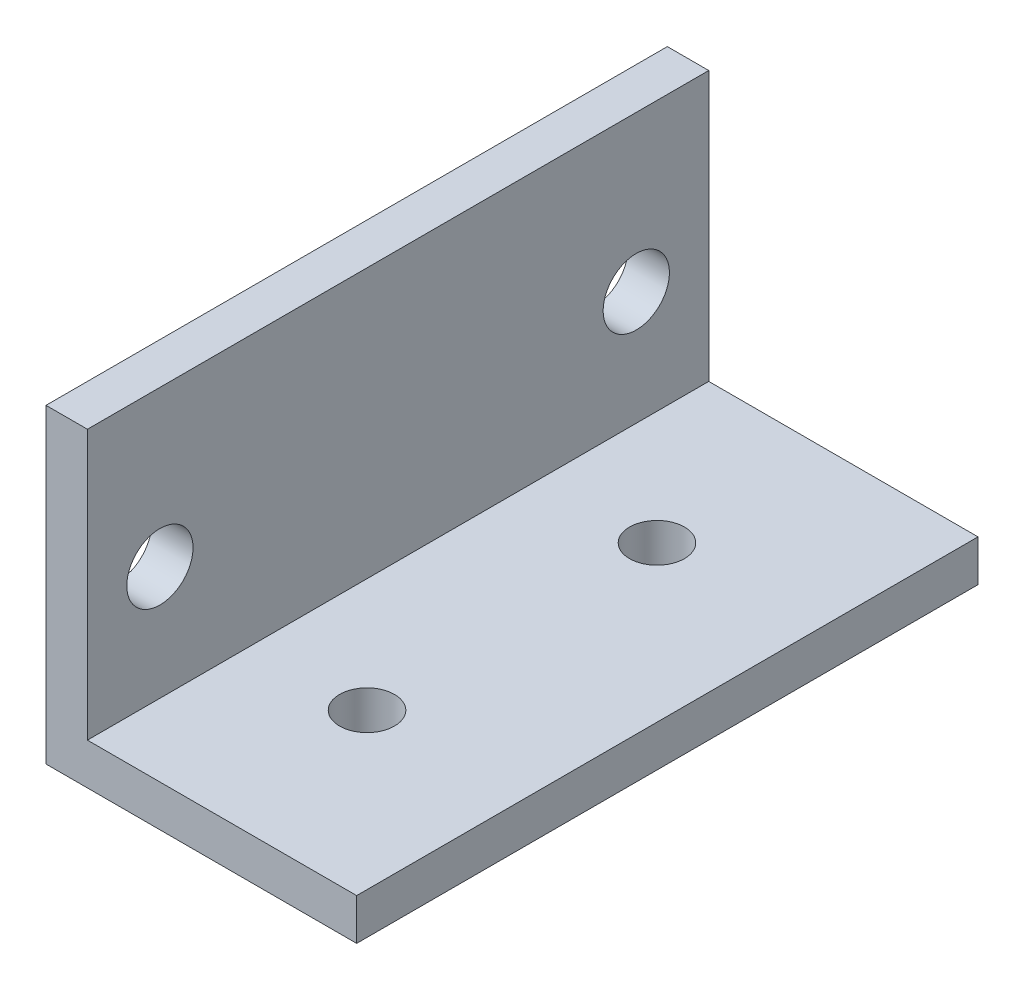
ISO-10303-21;
HEADER;
FILE_DESCRIPTION(('STEP AP214'),'2;1');
FILE_NAME('part.step','',(''),(''),'','','');
FILE_SCHEMA(('AUTOMOTIVE_DESIGN { 1 0 10303 214 1 1 1 1 }'));
ENDSEC;
DATA;
#1=APPLICATION_CONTEXT('core data for automotive mechanical design processes');
#2=APPLICATION_PROTOCOL_DEFINITION('international standard','automotive_design',2000,#1);
#3=PRODUCT_CONTEXT('',#1,'mechanical');
#4=PRODUCT('Part','Part','',(#3));
#5=PRODUCT_RELATED_PRODUCT_CATEGORY('part','',(#4));
#6=PRODUCT_DEFINITION_FORMATION('','',#4);
#7=PRODUCT_DEFINITION_CONTEXT('part definition',#1,'design');
#8=PRODUCT_DEFINITION('design','',#6,#7);
#9=PRODUCT_DEFINITION_SHAPE('','',#8);
#10=(LENGTH_UNIT() NAMED_UNIT(*) SI_UNIT(.MILLI.,.METRE.));
#11=(NAMED_UNIT(*) PLANE_ANGLE_UNIT() SI_UNIT($,.RADIAN.));
#12=(NAMED_UNIT(*) SI_UNIT($,.STERADIAN.) SOLID_ANGLE_UNIT());
#13=UNCERTAINTY_MEASURE_WITH_UNIT(LENGTH_MEASURE(1.E-05),#10,'distance_accuracy_value','');
#14=(GEOMETRIC_REPRESENTATION_CONTEXT(3) GLOBAL_UNCERTAINTY_ASSIGNED_CONTEXT((#13)) GLOBAL_UNIT_ASSIGNED_CONTEXT((#10,
#11,#12)) REPRESENTATION_CONTEXT('',''));
#15=CARTESIAN_POINT('',(0.,0.,0.));
#16=DIRECTION('',(0.,0.,1.));
#17=DIRECTION('',(1.,0.,0.));
#18=AXIS2_PLACEMENT_3D('',#15,#16,#17);
#19=CARTESIAN_POINT('',(4.,30.,60.));
#20=DIRECTION('',(0.,-1.,0.));
#21=DIRECTION('',(0.,0.,-1.));
#22=AXIS2_PLACEMENT_3D('',#19,#20,#21);
#23=PLANE('',#22);
#24=DIRECTION('',(-1.,0.,0.));
#25=VECTOR('',#24,1.);
#26=CARTESIAN_POINT('',(4.,30.,0.));
#27=LINE('',#26,#25);
#28=CARTESIAN_POINT('',(4.,30.,0.));
#29=VERTEX_POINT('',#28);
#30=CARTESIAN_POINT('',(0.,30.,0.));
#31=VERTEX_POINT('',#30);
#32=EDGE_CURVE('E118',#29,#31,#27,.T.);
#33=ORIENTED_EDGE('',*,*,#32,.T.);
#34=DIRECTION('',(0.,0.,-1.));
#35=VECTOR('',#34,1.);
#36=CARTESIAN_POINT('',(0.,30.,60.));
#37=LINE('',#36,#35);
#38=CARTESIAN_POINT('',(0.,30.,60.));
#39=VERTEX_POINT('',#38);
#40=EDGE_CURVE('E11',#39,#31,#37,.T.);
#41=ORIENTED_EDGE('',*,*,#40,.F.);
#42=DIRECTION('',(-1.,0.,0.));
#43=VECTOR('',#42,1.);
#44=CARTESIAN_POINT('',(4.,30.,60.));
#45=LINE('',#44,#43);
#46=CARTESIAN_POINT('',(4.,30.,60.));
#47=VERTEX_POINT('',#46);
#48=EDGE_CURVE('E129',#47,#39,#45,.T.);
#49=ORIENTED_EDGE('',*,*,#48,.F.);
#50=DIRECTION('',(0.,0.,-1.));
#51=VECTOR('',#50,1.);
#52=CARTESIAN_POINT('',(4.,30.,60.));
#53=LINE('',#52,#51);
#54=EDGE_CURVE('E114',#47,#29,#53,.T.);
#55=ORIENTED_EDGE('',*,*,#54,.T.);
#56=EDGE_LOOP('',(#33,#41,#49,#55));
#57=FACE_BOUND('',#56,.T.);
#58=ADVANCED_FACE('F33',(#57),#23,.F.);
#59=CARTESIAN_POINT('',(0.,30.,60.));
#60=DIRECTION('',(1.,0.,0.));
#61=DIRECTION('',(0.,0.,-1.));
#62=AXIS2_PLACEMENT_3D('',#59,#60,#61);
#63=PLANE('',#62);
#64=CARTESIAN_POINT('',(0.,15.,7.));
#65=DIRECTION('',(-1.,0.,0.));
#66=DIRECTION('',(0.,0.,1.));
#67=AXIS2_PLACEMENT_3D('',#64,#65,#66);
#68=CIRCLE('',#67,3.2);
#69=CARTESIAN_POINT('',(0.,15.,10.2));
#70=VERTEX_POINT('',#69);
#71=EDGE_CURVE('E270',#70,#70,#68,.T.);
#72=ORIENTED_EDGE('',*,*,#71,.F.);
#73=EDGE_LOOP('',(#72));
#74=FACE_BOUND('',#73,.T.);
#75=CARTESIAN_POINT('',(0.,15.,53.));
#76=DIRECTION('',(-1.,0.,0.));
#77=DIRECTION('',(0.,0.,1.));
#78=AXIS2_PLACEMENT_3D('',#75,#76,#77);
#79=CIRCLE('',#78,3.2);
#80=CARTESIAN_POINT('',(0.,15.,56.2));
#81=VERTEX_POINT('',#80);
#82=EDGE_CURVE('E260',#81,#81,#79,.T.);
#83=ORIENTED_EDGE('',*,*,#82,.F.);
#84=EDGE_LOOP('',(#83));
#85=FACE_BOUND('',#84,.T.);
#86=DIRECTION('',(0.,-1.,0.));
#87=VECTOR('',#86,1.);
#88=CARTESIAN_POINT('',(0.,30.,0.));
#89=LINE('',#88,#87);
#90=CARTESIAN_POINT('',(0.,0.,0.));
#91=VERTEX_POINT('',#90);
#92=EDGE_CURVE('E121',#31,#91,#89,.T.);
#93=ORIENTED_EDGE('',*,*,#92,.T.);
#94=DIRECTION('',(0.,0.,-1.));
#95=VECTOR('',#94,1.);
#96=CARTESIAN_POINT('',(0.,0.,60.));
#97=LINE('',#96,#95);
#98=CARTESIAN_POINT('',(0.,0.,60.));
#99=VERTEX_POINT('',#98);
#100=EDGE_CURVE('E42',#99,#91,#97,.T.);
#101=ORIENTED_EDGE('',*,*,#100,.F.);
#102=DIRECTION('',(0.,-1.,0.));
#103=VECTOR('',#102,1.);
#104=CARTESIAN_POINT('',(0.,30.,60.));
#105=LINE('',#104,#103);
#106=EDGE_CURVE('E87',#39,#99,#105,.T.);
#107=ORIENTED_EDGE('',*,*,#106,.F.);
#108=ORIENTED_EDGE('',*,*,#40,.T.);
#109=EDGE_LOOP('',(#93,#101,#107,#108));
#110=FACE_BOUND('',#109,.T.);
#111=ADVANCED_FACE('F158',(#74,#85,#110),#63,.F.);
#112=CARTESIAN_POINT('',(0.,0.,60.));
#113=DIRECTION('',(0.,1.,0.));
#114=DIRECTION('',(0.,0.,1.));
#115=AXIS2_PLACEMENT_3D('',#112,#113,#114);
#116=PLANE('',#115);
#117=CARTESIAN_POINT('',(15.,0.,16.));
#118=DIRECTION('',(0.,-1.,0.));
#119=DIRECTION('',(0.,0.,-1.));
#120=AXIS2_PLACEMENT_3D('',#117,#118,#119);
#121=CIRCLE('',#120,2.65);
#122=CARTESIAN_POINT('',(15.,0.,13.35));
#123=VERTEX_POINT('',#122);
#124=EDGE_CURVE('E279',#123,#123,#121,.T.);
#125=ORIENTED_EDGE('',*,*,#124,.F.);
#126=EDGE_LOOP('',(#125));
#127=FACE_BOUND('',#126,.T.);
#128=CARTESIAN_POINT('',(15.,0.,44.));
#129=DIRECTION('',(0.,-1.,0.));
#130=DIRECTION('',(0.,0.,-1.));
#131=AXIS2_PLACEMENT_3D('',#128,#129,#130);
#132=CIRCLE('',#131,2.65);
#133=CARTESIAN_POINT('',(15.,0.,41.35));
#134=VERTEX_POINT('',#133);
#135=EDGE_CURVE('E276',#134,#134,#132,.T.);
#136=ORIENTED_EDGE('',*,*,#135,.F.);
#137=EDGE_LOOP('',(#136));
#138=FACE_BOUND('',#137,.T.);
#139=DIRECTION('',(1.,0.,0.));
#140=VECTOR('',#139,1.);
#141=CARTESIAN_POINT('',(0.,0.,0.));
#142=LINE('',#141,#140);
#143=CARTESIAN_POINT('',(30.,0.,0.));
#144=VERTEX_POINT('',#143);
#145=EDGE_CURVE('E124',#91,#144,#142,.T.);
#146=ORIENTED_EDGE('',*,*,#145,.T.);
#147=DIRECTION('',(0.,0.,-1.));
#148=VECTOR('',#147,1.);
#149=CARTESIAN_POINT('',(30.,0.,60.));
#150=LINE('',#149,#148);
#151=CARTESIAN_POINT('',(30.,0.,60.));
#152=VERTEX_POINT('',#151);
#153=EDGE_CURVE('E109',#152,#144,#150,.T.);
#154=ORIENTED_EDGE('',*,*,#153,.F.);
#155=DIRECTION('',(1.,0.,0.));
#156=VECTOR('',#155,1.);
#157=CARTESIAN_POINT('',(0.,0.,60.));
#158=LINE('',#157,#156);
#159=EDGE_CURVE('E100',#99,#152,#158,.T.);
#160=ORIENTED_EDGE('',*,*,#159,.F.);
#161=ORIENTED_EDGE('',*,*,#100,.T.);
#162=EDGE_LOOP('',(#146,#154,#160,#161));
#163=FACE_BOUND('',#162,.T.);
#164=ADVANCED_FACE('F136',(#127,#138,#163),#116,.F.);
#165=CARTESIAN_POINT('',(30.,0.,60.));
#166=DIRECTION('',(-1.,0.,0.));
#167=DIRECTION('',(0.,0.,1.));
#168=AXIS2_PLACEMENT_3D('',#165,#166,#167);
#169=PLANE('',#168);
#170=DIRECTION('',(0.,1.,0.));
#171=VECTOR('',#170,1.);
#172=CARTESIAN_POINT('',(30.,0.,0.));
#173=LINE('',#172,#171);
#174=CARTESIAN_POINT('',(30.,4.,0.));
#175=VERTEX_POINT('',#174);
#176=EDGE_CURVE('E108',#144,#175,#173,.T.);
#177=ORIENTED_EDGE('',*,*,#176,.T.);
#178=DIRECTION('',(0.,0.,-1.));
#179=VECTOR('',#178,1.);
#180=CARTESIAN_POINT('',(30.,4.,60.));
#181=LINE('',#180,#179);
#182=CARTESIAN_POINT('',(30.,4.,60.));
#183=VERTEX_POINT('',#182);
#184=EDGE_CURVE('E105',#183,#175,#181,.T.);
#185=ORIENTED_EDGE('',*,*,#184,.F.);
#186=DIRECTION('',(0.,1.,0.));
#187=VECTOR('',#186,1.);
#188=CARTESIAN_POINT('',(30.,0.,60.));
#189=LINE('',#188,#187);
#190=EDGE_CURVE('E94',#152,#183,#189,.T.);
#191=ORIENTED_EDGE('',*,*,#190,.F.);
#192=ORIENTED_EDGE('',*,*,#153,.T.);
#193=EDGE_LOOP('',(#177,#185,#191,#192));
#194=FACE_BOUND('',#193,.T.);
#195=ADVANCED_FACE('F106',(#194),#169,.F.);
#196=CARTESIAN_POINT('',(30.,4.,60.));
#197=DIRECTION('',(0.,-1.,0.));
#198=DIRECTION('',(1.,0.,0.));
#199=AXIS2_PLACEMENT_3D('',#196,#197,#198);
#200=PLANE('',#199);
#201=CARTESIAN_POINT('',(15.,4.,16.));
#202=DIRECTION('',(0.,-1.,0.));
#203=DIRECTION('',(1.,0.,0.));
#204=AXIS2_PLACEMENT_3D('',#201,#202,#203);
#205=CIRCLE('',#204,2.65);
#206=CARTESIAN_POINT('',(17.65,4.,16.));
#207=VERTEX_POINT('',#206);
#208=EDGE_CURVE('E36',#207,#207,#205,.T.);
#209=ORIENTED_EDGE('',*,*,#208,.T.);
#210=EDGE_LOOP('',(#209));
#211=FACE_BOUND('',#210,.T.);
#212=CARTESIAN_POINT('',(15.,4.,44.));
#213=DIRECTION('',(0.,-1.,0.));
#214=DIRECTION('',(1.,0.,0.));
#215=AXIS2_PLACEMENT_3D('',#212,#213,#214);
#216=CIRCLE('',#215,2.65);
#217=CARTESIAN_POINT('',(17.65,4.,44.));
#218=VERTEX_POINT('',#217);
#219=EDGE_CURVE('E273',#218,#218,#216,.T.);
#220=ORIENTED_EDGE('',*,*,#219,.T.);
#221=EDGE_LOOP('',(#220));
#222=FACE_BOUND('',#221,.T.);
#223=DIRECTION('',(-1.,0.,0.));
#224=VECTOR('',#223,1.);
#225=CARTESIAN_POINT('',(30.,4.,0.));
#226=LINE('',#225,#224);
#227=CARTESIAN_POINT('',(4.,4.,0.));
#228=VERTEX_POINT('',#227);
#229=EDGE_CURVE('E73',#175,#228,#226,.T.);
#230=ORIENTED_EDGE('',*,*,#229,.T.);
#231=DIRECTION('',(0.,0.,-1.));
#232=VECTOR('',#231,1.);
#233=CARTESIAN_POINT('',(4.,4.,60.));
#234=LINE('',#233,#232);
#235=CARTESIAN_POINT('',(4.,4.,60.));
#236=VERTEX_POINT('',#235);
#237=EDGE_CURVE('E110',#236,#228,#234,.T.);
#238=ORIENTED_EDGE('',*,*,#237,.F.);
#239=DIRECTION('',(-1.,0.,0.));
#240=VECTOR('',#239,1.);
#241=CARTESIAN_POINT('',(30.,4.,60.));
#242=LINE('',#241,#240);
#243=EDGE_CURVE('E98',#183,#236,#242,.T.);
#244=ORIENTED_EDGE('',*,*,#243,.F.);
#245=ORIENTED_EDGE('',*,*,#184,.T.);
#246=EDGE_LOOP('',(#230,#238,#244,#245));
#247=FACE_BOUND('',#246,.T.);
#248=ADVANCED_FACE('F112',(#211,#222,#247),#200,.F.);
#249=CARTESIAN_POINT('',(4.,4.,60.));
#250=DIRECTION('',(-1.,0.,0.));
#251=DIRECTION('',(0.,0.,1.));
#252=AXIS2_PLACEMENT_3D('',#249,#250,#251);
#253=PLANE('',#252);
#254=CARTESIAN_POINT('',(4.,15.,7.));
#255=DIRECTION('',(-1.,0.,0.));
#256=DIRECTION('',(0.,0.,1.));
#257=AXIS2_PLACEMENT_3D('',#254,#255,#256);
#258=CIRCLE('',#257,3.2);
#259=CARTESIAN_POINT('',(4.,15.,10.2));
#260=VERTEX_POINT('',#259);
#261=EDGE_CURVE('E264',#260,#260,#258,.T.);
#262=ORIENTED_EDGE('',*,*,#261,.T.);
#263=EDGE_LOOP('',(#262));
#264=FACE_BOUND('',#263,.T.);
#265=CARTESIAN_POINT('',(4.,15.,53.));
#266=DIRECTION('',(-1.,0.,0.));
#267=DIRECTION('',(0.,0.,1.));
#268=AXIS2_PLACEMENT_3D('',#265,#266,#267);
#269=CIRCLE('',#268,3.2);
#270=CARTESIAN_POINT('',(4.,15.,56.2));
#271=VERTEX_POINT('',#270);
#272=EDGE_CURVE('E122',#271,#271,#269,.T.);
#273=ORIENTED_EDGE('',*,*,#272,.T.);
#274=EDGE_LOOP('',(#273));
#275=FACE_BOUND('',#274,.T.);
#276=DIRECTION('',(0.,1.,0.));
#277=VECTOR('',#276,1.);
#278=CARTESIAN_POINT('',(4.,4.,0.));
#279=LINE('',#278,#277);
#280=EDGE_CURVE('E79',#228,#29,#279,.T.);
#281=ORIENTED_EDGE('',*,*,#280,.T.);
#282=ORIENTED_EDGE('',*,*,#54,.F.);
#283=DIRECTION('',(0.,1.,0.));
#284=VECTOR('',#283,1.);
#285=CARTESIAN_POINT('',(4.,4.,60.));
#286=LINE('',#285,#284);
#287=EDGE_CURVE('E50',#236,#47,#286,.T.);
#288=ORIENTED_EDGE('',*,*,#287,.F.);
#289=ORIENTED_EDGE('',*,*,#237,.T.);
#290=EDGE_LOOP('',(#281,#282,#288,#289));
#291=FACE_BOUND('',#290,.T.);
#292=ADVANCED_FACE('F143',(#264,#275,#291),#253,.F.);
#293=CARTESIAN_POINT('',(0.,0.,60.));
#294=DIRECTION('',(0.,0.,1.));
#295=DIRECTION('',(1.,0.,0.));
#296=AXIS2_PLACEMENT_3D('',#293,#294,#295);
#297=PLANE('',#296);
#298=ORIENTED_EDGE('',*,*,#48,.T.);
#299=ORIENTED_EDGE('',*,*,#106,.T.);
#300=ORIENTED_EDGE('',*,*,#159,.T.);
#301=ORIENTED_EDGE('',*,*,#190,.T.);
#302=ORIENTED_EDGE('',*,*,#243,.T.);
#303=ORIENTED_EDGE('',*,*,#287,.T.);
#304=EDGE_LOOP('',(#298,#299,#300,#301,#302,#303));
#305=FACE_BOUND('',#304,.T.);
#306=ADVANCED_FACE('F96',(#305),#297,.T.);
#307=CARTESIAN_POINT('',(0.,0.,0.));
#308=DIRECTION('',(0.,0.,1.));
#309=DIRECTION('',(1.,0.,0.));
#310=AXIS2_PLACEMENT_3D('',#307,#308,#309);
#311=PLANE('',#310);
#312=ORIENTED_EDGE('',*,*,#32,.F.);
#313=ORIENTED_EDGE('',*,*,#280,.F.);
#314=ORIENTED_EDGE('',*,*,#229,.F.);
#315=ORIENTED_EDGE('',*,*,#176,.F.);
#316=ORIENTED_EDGE('',*,*,#145,.F.);
#317=ORIENTED_EDGE('',*,*,#92,.F.);
#318=EDGE_LOOP('',(#312,#313,#314,#315,#316,#317));
#319=FACE_BOUND('',#318,.T.);
#320=ADVANCED_FACE('F139',(#319),#311,.F.);
#321=CARTESIAN_POINT('',(0.,15.,53.));
#322=DIRECTION('',(-1.,0.,0.));
#323=DIRECTION('',(0.,0.,1.));
#324=AXIS2_PLACEMENT_3D('',#321,#322,#323);
#325=CYLINDRICAL_SURFACE('',#324,3.2);
#326=ORIENTED_EDGE('',*,*,#82,.T.);
#327=EDGE_LOOP('',(#326));
#328=FACE_BOUND('',#327,.T.);
#329=ORIENTED_EDGE('',*,*,#272,.F.);
#330=EDGE_LOOP('',(#329));
#331=FACE_BOUND('',#330,.T.);
#332=ADVANCED_FACE('F216',(#328,#331),#325,.F.);
#333=CARTESIAN_POINT('',(0.,15.,7.));
#334=DIRECTION('',(-1.,0.,0.));
#335=DIRECTION('',(0.,0.,1.));
#336=AXIS2_PLACEMENT_3D('',#333,#334,#335);
#337=CYLINDRICAL_SURFACE('',#336,3.2);
#338=ORIENTED_EDGE('',*,*,#71,.T.);
#339=EDGE_LOOP('',(#338));
#340=FACE_BOUND('',#339,.T.);
#341=ORIENTED_EDGE('',*,*,#261,.F.);
#342=EDGE_LOOP('',(#341));
#343=FACE_BOUND('',#342,.T.);
#344=ADVANCED_FACE('F196',(#340,#343),#337,.F.);
#345=CARTESIAN_POINT('',(15.,0.,44.));
#346=DIRECTION('',(0.,-1.,0.));
#347=DIRECTION('',(0.,0.,-1.));
#348=AXIS2_PLACEMENT_3D('',#345,#346,#347);
#349=CYLINDRICAL_SURFACE('',#348,2.65);
#350=ORIENTED_EDGE('',*,*,#135,.T.);
#351=EDGE_LOOP('',(#350));
#352=FACE_BOUND('',#351,.T.);
#353=ORIENTED_EDGE('',*,*,#219,.F.);
#354=EDGE_LOOP('',(#353));
#355=FACE_BOUND('',#354,.T.);
#356=ADVANCED_FACE('F190',(#352,#355),#349,.F.);
#357=CARTESIAN_POINT('',(15.,0.,16.));
#358=DIRECTION('',(0.,-1.,0.));
#359=DIRECTION('',(0.,0.,-1.));
#360=AXIS2_PLACEMENT_3D('',#357,#358,#359);
#361=CYLINDRICAL_SURFACE('',#360,2.65);
#362=ORIENTED_EDGE('',*,*,#124,.T.);
#363=EDGE_LOOP('',(#362));
#364=FACE_BOUND('',#363,.T.);
#365=ORIENTED_EDGE('',*,*,#208,.F.);
#366=EDGE_LOOP('',(#365));
#367=FACE_BOUND('',#366,.T.);
#368=ADVANCED_FACE('F195',(#364,#367),#361,.F.);
#369=CLOSED_SHELL('',(#58,#111,#164,#195,#248,#292,#306,#320,#332,#344,#356,#368));
#370=MANIFOLD_SOLID_BREP('B2',#369);
#371=ADVANCED_BREP_SHAPE_REPRESENTATION('',(#18,#370),#14);
#372=SHAPE_DEFINITION_REPRESENTATION(#9,#371);
ENDSEC;
END-ISO-10303-21;
